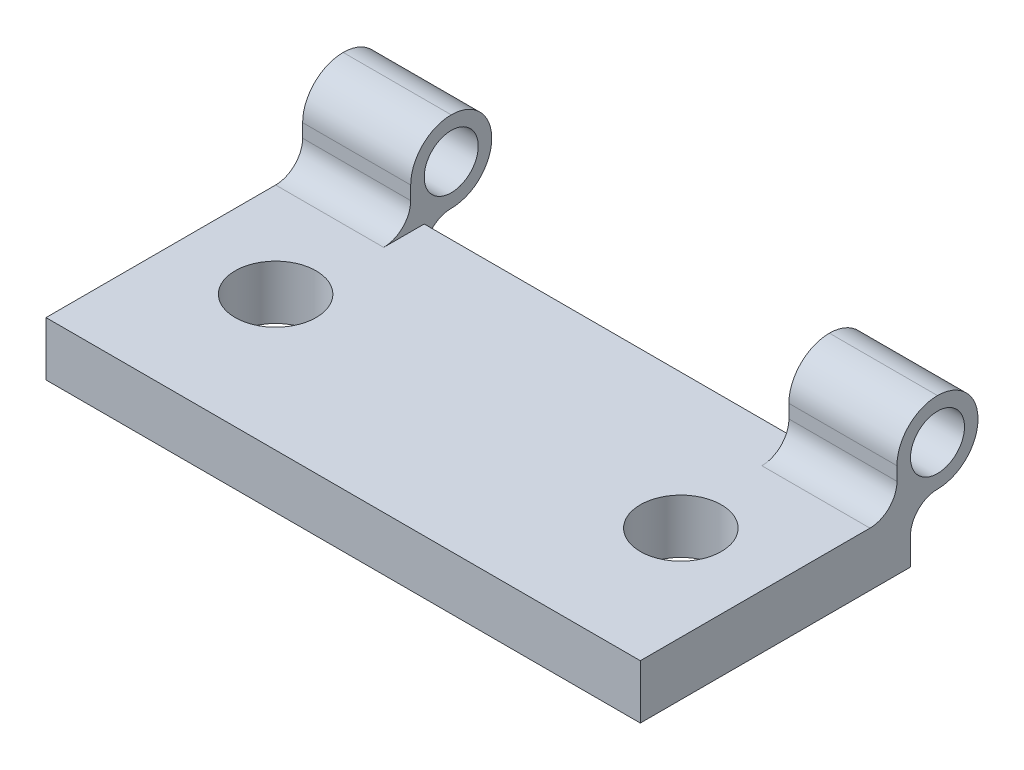
ISO-10303-21;
HEADER;
FILE_DESCRIPTION(('STEP AP214'),'2;1');
FILE_NAME('part.step','',(''),(''),'','','');
FILE_SCHEMA(('AUTOMOTIVE_DESIGN { 1 0 10303 214 1 1 1 1 }'));
ENDSEC;
DATA;
#1=APPLICATION_CONTEXT('core data for automotive mechanical design processes');
#2=APPLICATION_PROTOCOL_DEFINITION('international standard','automotive_design',2000,#1);
#3=PRODUCT_CONTEXT('',#1,'mechanical');
#4=PRODUCT('Part','Part','',(#3));
#5=PRODUCT_RELATED_PRODUCT_CATEGORY('part','',(#4));
#6=PRODUCT_DEFINITION_FORMATION('','',#4);
#7=PRODUCT_DEFINITION_CONTEXT('part definition',#1,'design');
#8=PRODUCT_DEFINITION('design','',#6,#7);
#9=PRODUCT_DEFINITION_SHAPE('','',#8);
#10=(LENGTH_UNIT() NAMED_UNIT(*) SI_UNIT(.MILLI.,.METRE.));
#11=(NAMED_UNIT(*) PLANE_ANGLE_UNIT() SI_UNIT($,.RADIAN.));
#12=(NAMED_UNIT(*) SI_UNIT($,.STERADIAN.) SOLID_ANGLE_UNIT());
#13=UNCERTAINTY_MEASURE_WITH_UNIT(LENGTH_MEASURE(1.E-05),#10,'distance_accuracy_value','');
#14=(GEOMETRIC_REPRESENTATION_CONTEXT(3) GLOBAL_UNCERTAINTY_ASSIGNED_CONTEXT((#13)) GLOBAL_UNIT_ASSIGNED_CONTEXT((#10,
#11,#12)) REPRESENTATION_CONTEXT('',''));
#15=CARTESIAN_POINT('',(0.,0.,0.));
#16=DIRECTION('',(0.,0.,1.));
#17=DIRECTION('',(1.,0.,0.));
#18=AXIS2_PLACEMENT_3D('',#15,#16,#17);
#19=CARTESIAN_POINT('',(0.,2.,0.));
#20=DIRECTION('',(0.,1.,0.));
#21=DIRECTION('',(0.,0.,1.));
#22=AXIS2_PLACEMENT_3D('',#19,#20,#21);
#23=PLANE('',#22);
#24=DIRECTION('',(0.,0.,-1.));
#25=VECTOR('',#24,1.);
#26=CARTESIAN_POINT('',(11.,2.,-5.));
#27=LINE('',#26,#25);
#28=CARTESIAN_POINT('',(11.,2.,5.));
#29=VERTEX_POINT('',#28);
#30=CARTESIAN_POINT('',(11.,2.,-3.5));
#31=VERTEX_POINT('',#30);
#32=EDGE_CURVE('E212',#29,#31,#27,.T.);
#33=ORIENTED_EDGE('',*,*,#32,.T.);
#34=DIRECTION('',(1.,0.,0.));
#35=VECTOR('',#34,1.);
#36=CARTESIAN_POINT('',(0.,2.,-3.5));
#37=LINE('',#36,#35);
#38=CARTESIAN_POINT('',(6.99999999999999,2.,-3.5));
#39=VERTEX_POINT('',#38);
#40=EDGE_CURVE('E277',#31,#39,#37,.F.);
#41=ORIENTED_EDGE('',*,*,#40,.T.);
#42=DIRECTION('',(0.,0.,1.));
#43=VECTOR('',#42,1.);
#44=CARTESIAN_POINT('',(7.,2.,0.));
#45=LINE('',#44,#43);
#46=CARTESIAN_POINT('',(6.99999999999999,2.,-5.));
#47=VERTEX_POINT('',#46);
#48=EDGE_CURVE('E219',#47,#39,#45,.T.);
#49=ORIENTED_EDGE('',*,*,#48,.F.);
#50=DIRECTION('',(-1.,0.,0.));
#51=VECTOR('',#50,1.);
#52=CARTESIAN_POINT('',(-11.,2.,-5.));
#53=LINE('',#52,#51);
#54=CARTESIAN_POINT('',(-6.99999999999999,2.,-5.));
#55=VERTEX_POINT('',#54);
#56=EDGE_CURVE('E175',#47,#55,#53,.T.);
#57=ORIENTED_EDGE('',*,*,#56,.T.);
#58=DIRECTION('',(0.,0.,1.));
#59=VECTOR('',#58,1.);
#60=CARTESIAN_POINT('',(-7.,2.,0.));
#61=LINE('',#60,#59);
#62=CARTESIAN_POINT('',(-6.99999999999999,2.,-3.5));
#63=VERTEX_POINT('',#62);
#64=EDGE_CURVE('E419',#55,#63,#61,.T.);
#65=ORIENTED_EDGE('',*,*,#64,.T.);
#66=DIRECTION('',(-1.,0.,0.));
#67=VECTOR('',#66,1.);
#68=CARTESIAN_POINT('',(-11.,2.,-3.5));
#69=LINE('',#68,#67);
#70=CARTESIAN_POINT('',(-11.,2.,-3.5));
#71=VERTEX_POINT('',#70);
#72=EDGE_CURVE('E172',#63,#71,#69,.T.);
#73=ORIENTED_EDGE('',*,*,#72,.T.);
#74=DIRECTION('',(0.,0.,1.));
#75=VECTOR('',#74,1.);
#76=CARTESIAN_POINT('',(-11.,2.,-5.));
#77=LINE('',#76,#75);
#78=CARTESIAN_POINT('',(-11.,2.,5.));
#79=VERTEX_POINT('',#78);
#80=EDGE_CURVE('E164',#71,#79,#77,.T.);
#81=ORIENTED_EDGE('',*,*,#80,.T.);
#82=DIRECTION('',(1.,0.,0.));
#83=VECTOR('',#82,1.);
#84=CARTESIAN_POINT('',(-11.,2.,5.));
#85=LINE('',#84,#83);
#86=EDGE_CURVE('E169',#79,#29,#85,.T.);
#87=ORIENTED_EDGE('',*,*,#86,.T.);
#88=EDGE_LOOP('',(#33,#41,#49,#57,#65,#73,#81,#87));
#89=FACE_BOUND('',#88,.T.);
#90=CARTESIAN_POINT('',(-7.5,2.,0.));
#91=DIRECTION('',(0.,1.,0.));
#92=DIRECTION('',(0.,0.,1.));
#93=AXIS2_PLACEMENT_3D('',#90,#91,#92);
#94=CIRCLE('',#93,1.5);
#95=CARTESIAN_POINT('',(-7.5,2.,1.5));
#96=VERTEX_POINT('',#95);
#97=EDGE_CURVE('E204',#96,#96,#94,.T.);
#98=ORIENTED_EDGE('',*,*,#97,.F.);
#99=EDGE_LOOP('',(#98));
#100=FACE_BOUND('',#99,.T.);
#101=CARTESIAN_POINT('',(7.5,2.,0.));
#102=DIRECTION('',(0.,1.,0.));
#103=DIRECTION('',(0.,0.,1.));
#104=AXIS2_PLACEMENT_3D('',#101,#102,#103);
#105=CIRCLE('',#104,1.5);
#106=CARTESIAN_POINT('',(7.5,2.,1.5));
#107=VERTEX_POINT('',#106);
#108=EDGE_CURVE('E379',#107,#107,#105,.T.);
#109=ORIENTED_EDGE('',*,*,#108,.F.);
#110=EDGE_LOOP('',(#109));
#111=FACE_BOUND('',#110,.T.);
#112=ADVANCED_FACE('F41',(#89,#100,#111),#23,.T.);
#113=CARTESIAN_POINT('',(0.,0.,0.));
#114=DIRECTION('',(0.,1.,0.));
#115=DIRECTION('',(0.,0.,1.));
#116=AXIS2_PLACEMENT_3D('',#113,#114,#115);
#117=PLANE('',#116);
#118=DIRECTION('',(0.,0.,-1.));
#119=VECTOR('',#118,1.);
#120=CARTESIAN_POINT('',(11.,0.,-5.));
#121=LINE('',#120,#119);
#122=CARTESIAN_POINT('',(11.,0.,5.));
#123=VERTEX_POINT('',#122);
#124=CARTESIAN_POINT('',(11.,0.,-5.));
#125=VERTEX_POINT('',#124);
#126=EDGE_CURVE('E199',#123,#125,#121,.T.);
#127=ORIENTED_EDGE('',*,*,#126,.F.);
#128=DIRECTION('',(1.,0.,0.));
#129=VECTOR('',#128,1.);
#130=CARTESIAN_POINT('',(-11.,0.,5.));
#131=LINE('',#130,#129);
#132=CARTESIAN_POINT('',(-11.,0.,5.));
#133=VERTEX_POINT('',#132);
#134=EDGE_CURVE('E210',#133,#123,#131,.T.);
#135=ORIENTED_EDGE('',*,*,#134,.F.);
#136=DIRECTION('',(0.,0.,1.));
#137=VECTOR('',#136,1.);
#138=CARTESIAN_POINT('',(-11.,0.,-5.));
#139=LINE('',#138,#137);
#140=CARTESIAN_POINT('',(-11.,0.,-5.));
#141=VERTEX_POINT('',#140);
#142=EDGE_CURVE('E183',#141,#133,#139,.T.);
#143=ORIENTED_EDGE('',*,*,#142,.F.);
#144=DIRECTION('',(-1.,0.,0.));
#145=VECTOR('',#144,1.);
#146=CARTESIAN_POINT('',(-11.,0.,-5.));
#147=LINE('',#146,#145);
#148=EDGE_CURVE('E203',#125,#141,#147,.T.);
#149=ORIENTED_EDGE('',*,*,#148,.F.);
#150=EDGE_LOOP('',(#127,#135,#143,#149));
#151=FACE_BOUND('',#150,.T.);
#152=CARTESIAN_POINT('',(-7.5,0.,0.));
#153=DIRECTION('',(0.,1.,0.));
#154=DIRECTION('',(0.,0.,1.));
#155=AXIS2_PLACEMENT_3D('',#152,#153,#154);
#156=CIRCLE('',#155,1.5);
#157=CARTESIAN_POINT('',(-7.5,0.,1.5));
#158=VERTEX_POINT('',#157);
#159=EDGE_CURVE('E383',#158,#158,#156,.T.);
#160=ORIENTED_EDGE('',*,*,#159,.T.);
#161=EDGE_LOOP('',(#160));
#162=FACE_BOUND('',#161,.T.);
#163=CARTESIAN_POINT('',(7.5,0.,0.));
#164=DIRECTION('',(0.,1.,0.));
#165=DIRECTION('',(0.,0.,1.));
#166=AXIS2_PLACEMENT_3D('',#163,#164,#165);
#167=CIRCLE('',#166,1.5);
#168=CARTESIAN_POINT('',(7.5,0.,1.5));
#169=VERTEX_POINT('',#168);
#170=EDGE_CURVE('E384',#169,#169,#167,.T.);
#171=ORIENTED_EDGE('',*,*,#170,.T.);
#172=EDGE_LOOP('',(#171));
#173=FACE_BOUND('',#172,.T.);
#174=ADVANCED_FACE('F464',(#151,#162,#173),#117,.F.);
#175=CARTESIAN_POINT('',(11.,2.,-5.));
#176=DIRECTION('',(-1.,0.,0.));
#177=DIRECTION('',(0.,0.,1.));
#178=AXIS2_PLACEMENT_3D('',#175,#176,#177);
#179=PLANE('',#178);
#180=CARTESIAN_POINT('',(11.,1.,-6.));
#181=DIRECTION('',(-1.,0.,0.));
#182=DIRECTION('',(0.,0.,1.));
#183=AXIS2_PLACEMENT_3D('',#180,#181,#182);
#184=CIRCLE('',#183,1.);
#185=CARTESIAN_POINT('',(11.,1.,-5.));
#186=VERTEX_POINT('',#185);
#187=CARTESIAN_POINT('',(11.,2.,-6.));
#188=VERTEX_POINT('',#187);
#189=EDGE_CURVE('E326',#186,#188,#184,.T.);
#190=ORIENTED_EDGE('',*,*,#189,.T.);
#191=CARTESIAN_POINT('',(11.,3.5,-6.));
#192=DIRECTION('',(-1.,0.,0.));
#193=DIRECTION('',(0.,0.,1.));
#194=AXIS2_PLACEMENT_3D('',#191,#192,#193);
#195=CIRCLE('',#194,1.5);
#196=CARTESIAN_POINT('',(11.,3.5,-7.5));
#197=VERTEX_POINT('',#196);
#198=EDGE_CURVE('E50',#188,#197,#195,.F.);
#199=ORIENTED_EDGE('',*,*,#198,.T.);
#200=CARTESIAN_POINT('',(11.,3.5,-6.));
#201=DIRECTION('',(-1.,0.,0.));
#202=DIRECTION('',(0.,0.,1.));
#203=AXIS2_PLACEMENT_3D('',#200,#201,#202);
#204=CIRCLE('',#203,1.5);
#205=CARTESIAN_POINT('',(11.,5.,-6.));
#206=VERTEX_POINT('',#205);
#207=EDGE_CURVE('E228',#197,#206,#204,.F.);
#208=ORIENTED_EDGE('',*,*,#207,.T.);
#209=CARTESIAN_POINT('',(11.,3.5,-6.));
#210=DIRECTION('',(-1.,0.,0.));
#211=DIRECTION('',(0.,0.,1.));
#212=AXIS2_PLACEMENT_3D('',#209,#210,#211);
#213=CIRCLE('',#212,1.5);
#214=CARTESIAN_POINT('',(11.,3.5,-4.5));
#215=VERTEX_POINT('',#214);
#216=EDGE_CURVE('E224',#206,#215,#213,.F.);
#217=ORIENTED_EDGE('',*,*,#216,.T.);
#218=DIRECTION('',(0.,1.,0.));
#219=VECTOR('',#218,1.);
#220=CARTESIAN_POINT('',(11.,0.,-4.5));
#221=LINE('',#220,#219);
#222=CARTESIAN_POINT('',(11.,3.,-4.5));
#223=VERTEX_POINT('',#222);
#224=EDGE_CURVE('E374',#223,#215,#221,.T.);
#225=ORIENTED_EDGE('',*,*,#224,.F.);
#226=CARTESIAN_POINT('',(11.,3.,-3.5));
#227=DIRECTION('',(-1.,0.,0.));
#228=DIRECTION('',(0.,0.,1.));
#229=AXIS2_PLACEMENT_3D('',#226,#227,#228);
#230=CIRCLE('',#229,1.);
#231=EDGE_CURVE('E284',#223,#31,#230,.T.);
#232=ORIENTED_EDGE('',*,*,#231,.T.);
#233=ORIENTED_EDGE('',*,*,#32,.F.);
#234=DIRECTION('',(0.,-1.,0.));
#235=VECTOR('',#234,1.);
#236=CARTESIAN_POINT('',(11.,2.,5.));
#237=LINE('',#236,#235);
#238=EDGE_CURVE('E188',#29,#123,#237,.T.);
#239=ORIENTED_EDGE('',*,*,#238,.T.);
#240=ORIENTED_EDGE('',*,*,#126,.T.);
#241=DIRECTION('',(0.,-1.,0.));
#242=VECTOR('',#241,1.);
#243=CARTESIAN_POINT('',(11.,2.,-5.));
#244=LINE('',#243,#242);
#245=EDGE_CURVE('E216',#186,#125,#244,.T.);
#246=ORIENTED_EDGE('',*,*,#245,.F.);
#247=EDGE_LOOP('',(#190,#199,#208,#217,#225,#232,#233,#239,#240,#246));
#248=FACE_BOUND('',#247,.T.);
#249=CARTESIAN_POINT('',(11.,3.5,-6.));
#250=DIRECTION('',(1.,0.,0.));
#251=DIRECTION('',(0.,0.,-1.));
#252=AXIS2_PLACEMENT_3D('',#249,#250,#251);
#253=CIRCLE('',#252,1.);
#254=CARTESIAN_POINT('',(11.,3.5,-7.));
#255=VERTEX_POINT('',#254);
#256=EDGE_CURVE('E370',#255,#255,#253,.T.);
#257=ORIENTED_EDGE('',*,*,#256,.F.);
#258=EDGE_LOOP('',(#257));
#259=FACE_BOUND('',#258,.T.);
#260=ADVANCED_FACE('F338',(#248,#259),#179,.F.);
#261=CARTESIAN_POINT('',(-11.,2.,-5.));
#262=DIRECTION('',(0.,0.,1.));
#263=DIRECTION('',(1.,0.,0.));
#264=AXIS2_PLACEMENT_3D('',#261,#262,#263);
#265=PLANE('',#264);
#266=DIRECTION('',(0.,-1.,0.));
#267=VECTOR('',#266,1.);
#268=CARTESIAN_POINT('',(-11.,2.,-5.));
#269=LINE('',#268,#267);
#270=CARTESIAN_POINT('',(-11.,1.,-5.));
#271=VERTEX_POINT('',#270);
#272=EDGE_CURVE('E187',#271,#141,#269,.T.);
#273=ORIENTED_EDGE('',*,*,#272,.F.);
#274=DIRECTION('',(1.,0.,0.));
#275=VECTOR('',#274,1.);
#276=CARTESIAN_POINT('',(-11.,1.,-5.));
#277=LINE('',#276,#275);
#278=CARTESIAN_POINT('',(-6.99999999999999,1.,-5.));
#279=VERTEX_POINT('',#278);
#280=EDGE_CURVE('E305',#271,#279,#277,.T.);
#281=ORIENTED_EDGE('',*,*,#280,.T.);
#282=DIRECTION('',(0.,1.,0.));
#283=VECTOR('',#282,1.);
#284=CARTESIAN_POINT('',(-6.99999999999999,0.,-5.));
#285=LINE('',#284,#283);
#286=EDGE_CURVE('E302',#279,#55,#285,.T.);
#287=ORIENTED_EDGE('',*,*,#286,.T.);
#288=ORIENTED_EDGE('',*,*,#56,.F.);
#289=DIRECTION('',(0.,-1.,0.));
#290=VECTOR('',#289,1.);
#291=CARTESIAN_POINT('',(6.99999999999999,0.,-5.));
#292=LINE('',#291,#290);
#293=CARTESIAN_POINT('',(6.99999999999999,1.,-5.));
#294=VERTEX_POINT('',#293);
#295=EDGE_CURVE('E57',#47,#294,#292,.T.);
#296=ORIENTED_EDGE('',*,*,#295,.T.);
#297=DIRECTION('',(-1.,0.,0.));
#298=VECTOR('',#297,1.);
#299=CARTESIAN_POINT('',(11.,1.,-5.));
#300=LINE('',#299,#298);
#301=EDGE_CURVE('E297',#294,#186,#300,.F.);
#302=ORIENTED_EDGE('',*,*,#301,.T.);
#303=ORIENTED_EDGE('',*,*,#245,.T.);
#304=ORIENTED_EDGE('',*,*,#148,.T.);
#305=EDGE_LOOP('',(#273,#281,#287,#288,#296,#302,#303,#304));
#306=FACE_BOUND('',#305,.T.);
#307=ADVANCED_FACE('F356',(#306),#265,.F.);
#308=CARTESIAN_POINT('',(-11.,2.,-5.));
#309=DIRECTION('',(1.,0.,0.));
#310=DIRECTION('',(0.,0.,-1.));
#311=AXIS2_PLACEMENT_3D('',#308,#309,#310);
#312=PLANE('',#311);
#313=CARTESIAN_POINT('',(-11.,3.5,-6.));
#314=DIRECTION('',(1.,0.,0.));
#315=DIRECTION('',(0.,0.,-1.));
#316=AXIS2_PLACEMENT_3D('',#313,#314,#315);
#317=CIRCLE('',#316,1.5);
#318=CARTESIAN_POINT('',(-11.,5.,-6.));
#319=VERTEX_POINT('',#318);
#320=CARTESIAN_POINT('',(-11.,3.5,-7.5));
#321=VERTEX_POINT('',#320);
#322=EDGE_CURVE('E244',#319,#321,#317,.F.);
#323=ORIENTED_EDGE('',*,*,#322,.T.);
#324=CARTESIAN_POINT('',(-11.,3.5,-6.));
#325=DIRECTION('',(1.,0.,0.));
#326=DIRECTION('',(0.,0.,-1.));
#327=AXIS2_PLACEMENT_3D('',#324,#325,#326);
#328=CIRCLE('',#327,1.5);
#329=CARTESIAN_POINT('',(-11.,2.,-6.));
#330=VERTEX_POINT('',#329);
#331=EDGE_CURVE('E330',#321,#330,#328,.F.);
#332=ORIENTED_EDGE('',*,*,#331,.T.);
#333=CARTESIAN_POINT('',(-11.,1.,-6.));
#334=DIRECTION('',(1.,0.,0.));
#335=DIRECTION('',(0.,0.,-1.));
#336=AXIS2_PLACEMENT_3D('',#333,#334,#335);
#337=CIRCLE('',#336,1.);
#338=EDGE_CURVE('E320',#330,#271,#337,.T.);
#339=ORIENTED_EDGE('',*,*,#338,.T.);
#340=ORIENTED_EDGE('',*,*,#272,.T.);
#341=ORIENTED_EDGE('',*,*,#142,.T.);
#342=DIRECTION('',(0.,-1.,0.));
#343=VECTOR('',#342,1.);
#344=CARTESIAN_POINT('',(-11.,2.,5.));
#345=LINE('',#344,#343);
#346=EDGE_CURVE('E178',#79,#133,#345,.T.);
#347=ORIENTED_EDGE('',*,*,#346,.F.);
#348=ORIENTED_EDGE('',*,*,#80,.F.);
#349=CARTESIAN_POINT('',(-11.,3.,-3.5));
#350=DIRECTION('',(1.,0.,0.));
#351=DIRECTION('',(0.,0.,-1.));
#352=AXIS2_PLACEMENT_3D('',#349,#350,#351);
#353=CIRCLE('',#352,1.);
#354=CARTESIAN_POINT('',(-11.,3.,-4.5));
#355=VERTEX_POINT('',#354);
#356=EDGE_CURVE('E290',#71,#355,#353,.T.);
#357=ORIENTED_EDGE('',*,*,#356,.T.);
#358=DIRECTION('',(0.,1.,0.));
#359=VECTOR('',#358,1.);
#360=CARTESIAN_POINT('',(-11.,0.,-4.5));
#361=LINE('',#360,#359);
#362=CARTESIAN_POINT('',(-11.,3.5,-4.5));
#363=VERTEX_POINT('',#362);
#364=EDGE_CURVE('E410',#355,#363,#361,.T.);
#365=ORIENTED_EDGE('',*,*,#364,.T.);
#366=CARTESIAN_POINT('',(-11.,3.5,-6.));
#367=DIRECTION('',(1.,0.,0.));
#368=DIRECTION('',(0.,0.,-1.));
#369=AXIS2_PLACEMENT_3D('',#366,#367,#368);
#370=CIRCLE('',#369,1.5);
#371=EDGE_CURVE('E241',#363,#319,#370,.F.);
#372=ORIENTED_EDGE('',*,*,#371,.T.);
#373=EDGE_LOOP('',(#323,#332,#339,#340,#341,#347,#348,#357,#365,#372));
#374=FACE_BOUND('',#373,.T.);
#375=CARTESIAN_POINT('',(-11.,3.5,-6.));
#376=DIRECTION('',(1.,0.,0.));
#377=DIRECTION('',(0.,0.,-1.));
#378=AXIS2_PLACEMENT_3D('',#375,#376,#377);
#379=CIRCLE('',#378,1.);
#380=CARTESIAN_POINT('',(-11.,3.5,-7.));
#381=VERTEX_POINT('',#380);
#382=EDGE_CURVE('E267',#381,#381,#379,.T.);
#383=ORIENTED_EDGE('',*,*,#382,.T.);
#384=EDGE_LOOP('',(#383));
#385=FACE_BOUND('',#384,.T.);
#386=ADVANCED_FACE('F180',(#374,#385),#312,.F.);
#387=CARTESIAN_POINT('',(-11.,2.,5.));
#388=DIRECTION('',(0.,0.,-1.));
#389=DIRECTION('',(-1.,0.,0.));
#390=AXIS2_PLACEMENT_3D('',#387,#388,#389);
#391=PLANE('',#390);
#392=ORIENTED_EDGE('',*,*,#134,.T.);
#393=ORIENTED_EDGE('',*,*,#238,.F.);
#394=ORIENTED_EDGE('',*,*,#86,.F.);
#395=ORIENTED_EDGE('',*,*,#346,.T.);
#396=EDGE_LOOP('',(#392,#393,#394,#395));
#397=FACE_BOUND('',#396,.T.);
#398=ADVANCED_FACE('F190',(#397),#391,.F.);
#399=CARTESIAN_POINT('',(-7.5,2.,0.));
#400=DIRECTION('',(0.,-1.,0.));
#401=DIRECTION('',(0.,0.,-1.));
#402=AXIS2_PLACEMENT_3D('',#399,#400,#401);
#403=CYLINDRICAL_SURFACE('',#402,1.5);
#404=ORIENTED_EDGE('',*,*,#97,.T.);
#405=EDGE_LOOP('',(#404));
#406=FACE_BOUND('',#405,.T.);
#407=ORIENTED_EDGE('',*,*,#159,.F.);
#408=EDGE_LOOP('',(#407));
#409=FACE_BOUND('',#408,.T.);
#410=ADVANCED_FACE('F474',(#406,#409),#403,.F.);
#411=CARTESIAN_POINT('',(7.5,2.,0.));
#412=DIRECTION('',(0.,-1.,0.));
#413=DIRECTION('',(0.,0.,-1.));
#414=AXIS2_PLACEMENT_3D('',#411,#412,#413);
#415=CYLINDRICAL_SURFACE('',#414,1.5);
#416=ORIENTED_EDGE('',*,*,#108,.T.);
#417=EDGE_LOOP('',(#416));
#418=FACE_BOUND('',#417,.T.);
#419=ORIENTED_EDGE('',*,*,#170,.F.);
#420=EDGE_LOOP('',(#419));
#421=FACE_BOUND('',#420,.T.);
#422=ADVANCED_FACE('F472',(#418,#421),#415,.F.);
#423=CARTESIAN_POINT('',(6.99999999999999,0.,-4.5));
#424=DIRECTION('',(0.,0.,-1.));
#425=DIRECTION('',(-1.,0.,0.));
#426=AXIS2_PLACEMENT_3D('',#423,#424,#425);
#427=PLANE('',#426);
#428=DIRECTION('',(0.,1.,0.));
#429=VECTOR('',#428,1.);
#430=CARTESIAN_POINT('',(6.99999999999999,0.,-4.5));
#431=LINE('',#430,#429);
#432=CARTESIAN_POINT('',(6.99999999999999,3.,-4.5));
#433=VERTEX_POINT('',#432);
#434=CARTESIAN_POINT('',(6.99999999999999,3.5,-4.5));
#435=VERTEX_POINT('',#434);
#436=EDGE_CURVE('E368',#433,#435,#431,.T.);
#437=ORIENTED_EDGE('',*,*,#436,.F.);
#438=DIRECTION('',(1.,0.,0.));
#439=VECTOR('',#438,1.);
#440=CARTESIAN_POINT('',(6.99999999999999,3.,-4.5));
#441=LINE('',#440,#439);
#442=EDGE_CURVE('E262',#433,#223,#441,.T.);
#443=ORIENTED_EDGE('',*,*,#442,.T.);
#444=ORIENTED_EDGE('',*,*,#224,.T.);
#445=DIRECTION('',(1.,0.,0.));
#446=VECTOR('',#445,1.);
#447=CARTESIAN_POINT('',(6.99999999999999,3.5,-4.5));
#448=LINE('',#447,#446);
#449=EDGE_CURVE('E237',#215,#435,#448,.F.);
#450=ORIENTED_EDGE('',*,*,#449,.T.);
#451=EDGE_LOOP('',(#437,#443,#444,#450));
#452=FACE_BOUND('',#451,.T.);
#453=ADVANCED_FACE('F400',(#452),#427,.F.);
#454=CARTESIAN_POINT('',(6.99999999999999,3.5,-6.));
#455=DIRECTION('',(1.,0.,0.));
#456=DIRECTION('',(0.,0.,-1.));
#457=AXIS2_PLACEMENT_3D('',#454,#455,#456);
#458=CYLINDRICAL_SURFACE('',#457,1.);
#459=CARTESIAN_POINT('',(6.99999999999999,3.5,-6.));
#460=DIRECTION('',(1.,0.,0.));
#461=DIRECTION('',(0.,0.,-1.));
#462=AXIS2_PLACEMENT_3D('',#459,#460,#461);
#463=CIRCLE('',#462,1.);
#464=CARTESIAN_POINT('',(6.99999999999999,3.5,-7.));
#465=VERTEX_POINT('',#464);
#466=EDGE_CURVE('E378',#465,#465,#463,.T.);
#467=ORIENTED_EDGE('',*,*,#466,.F.);
#468=EDGE_LOOP('',(#467));
#469=FACE_BOUND('',#468,.T.);
#470=ORIENTED_EDGE('',*,*,#256,.T.);
#471=EDGE_LOOP('',(#470));
#472=FACE_BOUND('',#471,.T.);
#473=ADVANCED_FACE('F482',(#469,#472),#458,.F.);
#474=CARTESIAN_POINT('',(7.,0.,0.));
#475=DIRECTION('',(1.,0.,0.));
#476=DIRECTION('',(0.,0.,-1.));
#477=AXIS2_PLACEMENT_3D('',#474,#475,#476);
#478=PLANE('',#477);
#479=ORIENTED_EDGE('',*,*,#466,.T.);
#480=EDGE_LOOP('',(#479));
#481=FACE_BOUND('',#480,.T.);
#482=CARTESIAN_POINT('',(6.99999999999999,3.5,-6.));
#483=DIRECTION('',(1.,0.,0.));
#484=DIRECTION('',(0.,0.,-1.));
#485=AXIS2_PLACEMENT_3D('',#482,#483,#484);
#486=CIRCLE('',#485,1.5);
#487=CARTESIAN_POINT('',(6.99999999999999,5.,-6.));
#488=VERTEX_POINT('',#487);
#489=CARTESIAN_POINT('',(6.99999999999999,3.5,-7.5));
#490=VERTEX_POINT('',#489);
#491=EDGE_CURVE('E234',#488,#490,#486,.F.);
#492=ORIENTED_EDGE('',*,*,#491,.T.);
#493=CARTESIAN_POINT('',(6.99999999999999,3.5,-6.));
#494=DIRECTION('',(1.,0.,0.));
#495=DIRECTION('',(0.,0.,-1.));
#496=AXIS2_PLACEMENT_3D('',#493,#494,#495);
#497=CIRCLE('',#496,1.5);
#498=CARTESIAN_POINT('',(6.99999999999999,2.,-6.));
#499=VERTEX_POINT('',#498);
#500=EDGE_CURVE('E11',#490,#499,#497,.F.);
#501=ORIENTED_EDGE('',*,*,#500,.T.);
#502=CARTESIAN_POINT('',(6.99999999999999,1.,-6.));
#503=DIRECTION('',(1.,0.,0.));
#504=DIRECTION('',(0.,0.,-1.));
#505=AXIS2_PLACEMENT_3D('',#502,#503,#504);
#506=CIRCLE('',#505,1.);
#507=EDGE_CURVE('E323',#499,#294,#506,.T.);
#508=ORIENTED_EDGE('',*,*,#507,.T.);
#509=ORIENTED_EDGE('',*,*,#295,.F.);
#510=ORIENTED_EDGE('',*,*,#48,.T.);
#511=CARTESIAN_POINT('',(6.99999999999999,3.,-3.5));
#512=DIRECTION('',(1.,0.,0.));
#513=DIRECTION('',(0.,0.,-1.));
#514=AXIS2_PLACEMENT_3D('',#511,#512,#513);
#515=CIRCLE('',#514,1.);
#516=EDGE_CURVE('E287',#39,#433,#515,.T.);
#517=ORIENTED_EDGE('',*,*,#516,.T.);
#518=ORIENTED_EDGE('',*,*,#436,.T.);
#519=CARTESIAN_POINT('',(6.99999999999999,3.5,-6.));
#520=DIRECTION('',(1.,0.,0.));
#521=DIRECTION('',(0.,0.,-1.));
#522=AXIS2_PLACEMENT_3D('',#519,#520,#521);
#523=CIRCLE('',#522,1.5);
#524=EDGE_CURVE('E231',#435,#488,#523,.F.);
#525=ORIENTED_EDGE('',*,*,#524,.T.);
#526=EDGE_LOOP('',(#492,#501,#508,#509,#510,#517,#518,#525));
#527=FACE_BOUND('',#526,.T.);
#528=ADVANCED_FACE('F353',(#481,#527),#478,.F.);
#529=CARTESIAN_POINT('',(-6.99999999999999,0.,-4.5));
#530=DIRECTION('',(0.,0.,1.));
#531=DIRECTION('',(1.,0.,0.));
#532=AXIS2_PLACEMENT_3D('',#529,#530,#531);
#533=PLANE('',#532);
#534=ORIENTED_EDGE('',*,*,#364,.F.);
#535=DIRECTION('',(-1.,0.,0.));
#536=VECTOR('',#535,1.);
#537=CARTESIAN_POINT('',(-6.99999999999999,3.,-4.5));
#538=LINE('',#537,#536);
#539=CARTESIAN_POINT('',(-6.99999999999999,3.,-4.5));
#540=VERTEX_POINT('',#539);
#541=EDGE_CURVE('E281',#355,#540,#538,.F.);
#542=ORIENTED_EDGE('',*,*,#541,.T.);
#543=DIRECTION('',(0.,1.,0.));
#544=VECTOR('',#543,1.);
#545=CARTESIAN_POINT('',(-6.99999999999999,0.,-4.5));
#546=LINE('',#545,#544);
#547=CARTESIAN_POINT('',(-6.99999999999999,3.5,-4.5));
#548=VERTEX_POINT('',#547);
#549=EDGE_CURVE('E375',#540,#548,#546,.T.);
#550=ORIENTED_EDGE('',*,*,#549,.T.);
#551=DIRECTION('',(-1.,0.,0.));
#552=VECTOR('',#551,1.);
#553=CARTESIAN_POINT('',(-6.99999999999999,3.5,-4.5));
#554=LINE('',#553,#552);
#555=EDGE_CURVE('E258',#548,#363,#554,.T.);
#556=ORIENTED_EDGE('',*,*,#555,.T.);
#557=EDGE_LOOP('',(#534,#542,#550,#556));
#558=FACE_BOUND('',#557,.T.);
#559=ADVANCED_FACE('F456',(#558),#533,.T.);
#560=CARTESIAN_POINT('',(-6.99999999999999,3.5,-6.));
#561=DIRECTION('',(-1.,0.,0.));
#562=DIRECTION('',(0.,0.,1.));
#563=AXIS2_PLACEMENT_3D('',#560,#561,#562);
#564=CYLINDRICAL_SURFACE('',#563,1.);
#565=CARTESIAN_POINT('',(-6.99999999999999,3.5,-6.));
#566=DIRECTION('',(1.,0.,0.));
#567=DIRECTION('',(0.,0.,-1.));
#568=AXIS2_PLACEMENT_3D('',#565,#566,#567);
#569=CIRCLE('',#568,1.);
#570=CARTESIAN_POINT('',(-6.99999999999999,3.5,-7.));
#571=VERTEX_POINT('',#570);
#572=EDGE_CURVE('E413',#571,#571,#569,.T.);
#573=ORIENTED_EDGE('',*,*,#572,.T.);
#574=EDGE_LOOP('',(#573));
#575=FACE_BOUND('',#574,.T.);
#576=ORIENTED_EDGE('',*,*,#382,.F.);
#577=EDGE_LOOP('',(#576));
#578=FACE_BOUND('',#577,.T.);
#579=ADVANCED_FACE('F426',(#575,#578),#564,.F.);
#580=CARTESIAN_POINT('',(-7.,0.,0.));
#581=DIRECTION('',(-1.,0.,0.));
#582=DIRECTION('',(0.,0.,-1.));
#583=AXIS2_PLACEMENT_3D('',#580,#581,#582);
#584=PLANE('',#583);
#585=ORIENTED_EDGE('',*,*,#572,.F.);
#586=EDGE_LOOP('',(#585));
#587=FACE_BOUND('',#586,.T.);
#588=CARTESIAN_POINT('',(-6.99999999999999,1.,-6.));
#589=DIRECTION('',(-1.,0.,0.));
#590=DIRECTION('',(0.,0.,1.));
#591=AXIS2_PLACEMENT_3D('',#588,#589,#590);
#592=CIRCLE('',#591,1.);
#593=CARTESIAN_POINT('',(-6.99999999999999,2.,-6.));
#594=VERTEX_POINT('',#593);
#595=EDGE_CURVE('E317',#279,#594,#592,.T.);
#596=ORIENTED_EDGE('',*,*,#595,.T.);
#597=CARTESIAN_POINT('',(-6.99999999999999,3.5,-6.));
#598=DIRECTION('',(-1.,0.,0.));
#599=DIRECTION('',(0.,0.,1.));
#600=AXIS2_PLACEMENT_3D('',#597,#598,#599);
#601=CIRCLE('',#600,1.5);
#602=CARTESIAN_POINT('',(-6.99999999999999,3.5,-7.5));
#603=VERTEX_POINT('',#602);
#604=EDGE_CURVE('E333',#594,#603,#601,.F.);
#605=ORIENTED_EDGE('',*,*,#604,.T.);
#606=CARTESIAN_POINT('',(-6.99999999999999,3.5,-6.));
#607=DIRECTION('',(-1.,0.,0.));
#608=DIRECTION('',(0.,0.,1.));
#609=AXIS2_PLACEMENT_3D('',#606,#607,#608);
#610=CIRCLE('',#609,1.5);
#611=CARTESIAN_POINT('',(-6.99999999999999,5.,-6.));
#612=VERTEX_POINT('',#611);
#613=EDGE_CURVE('E255',#603,#612,#610,.F.);
#614=ORIENTED_EDGE('',*,*,#613,.T.);
#615=CARTESIAN_POINT('',(-6.99999999999999,3.5,-6.));
#616=DIRECTION('',(-1.,0.,0.));
#617=DIRECTION('',(0.,0.,1.));
#618=AXIS2_PLACEMENT_3D('',#615,#616,#617);
#619=CIRCLE('',#618,1.5);
#620=EDGE_CURVE('E251',#612,#548,#619,.F.);
#621=ORIENTED_EDGE('',*,*,#620,.T.);
#622=ORIENTED_EDGE('',*,*,#549,.F.);
#623=CARTESIAN_POINT('',(-6.99999999999999,3.,-3.5));
#624=DIRECTION('',(-1.,0.,0.));
#625=DIRECTION('',(0.,0.,1.));
#626=AXIS2_PLACEMENT_3D('',#623,#624,#625);
#627=CIRCLE('',#626,1.);
#628=EDGE_CURVE('E293',#540,#63,#627,.T.);
#629=ORIENTED_EDGE('',*,*,#628,.T.);
#630=ORIENTED_EDGE('',*,*,#64,.F.);
#631=ORIENTED_EDGE('',*,*,#286,.F.);
#632=EDGE_LOOP('',(#596,#605,#614,#621,#622,#629,#630,#631));
#633=FACE_BOUND('',#632,.T.);
#634=ADVANCED_FACE('F429',(#587,#633),#584,.F.);
#635=CARTESIAN_POINT('',(6.99999999999999,3.5,-6.));
#636=DIRECTION('',(1.,0.,0.));
#637=DIRECTION('',(0.,0.,-1.));
#638=AXIS2_PLACEMENT_3D('',#635,#636,#637);
#639=CYLINDRICAL_SURFACE('',#638,1.5);
#640=DIRECTION('',(1.,0.,0.));
#641=VECTOR('',#640,1.);
#642=CARTESIAN_POINT('',(6.99999999999999,5.,-6.));
#643=LINE('',#642,#641);
#644=EDGE_CURVE('E263',#488,#206,#643,.T.);
#645=ORIENTED_EDGE('',*,*,#644,.F.);
#646=ORIENTED_EDGE('',*,*,#524,.F.);
#647=ORIENTED_EDGE('',*,*,#449,.F.);
#648=ORIENTED_EDGE('',*,*,#216,.F.);
#649=EDGE_LOOP('',(#645,#646,#647,#648));
#650=FACE_BOUND('',#649,.T.);
#651=ADVANCED_FACE('F432',(#650),#639,.T.);
#652=CARTESIAN_POINT('',(6.99999999999999,3.5,-6.));
#653=DIRECTION('',(1.,0.,0.));
#654=DIRECTION('',(0.,0.,-1.));
#655=AXIS2_PLACEMENT_3D('',#652,#653,#654);
#656=CYLINDRICAL_SURFACE('',#655,1.5);
#657=ORIENTED_EDGE('',*,*,#491,.F.);
#658=ORIENTED_EDGE('',*,*,#644,.T.);
#659=ORIENTED_EDGE('',*,*,#207,.F.);
#660=DIRECTION('',(1.,0.,0.));
#661=VECTOR('',#660,1.);
#662=CARTESIAN_POINT('',(6.99999999999999,3.5,-7.5));
#663=LINE('',#662,#661);
#664=EDGE_CURVE('E220',#490,#197,#663,.T.);
#665=ORIENTED_EDGE('',*,*,#664,.F.);
#666=EDGE_LOOP('',(#657,#658,#659,#665));
#667=FACE_BOUND('',#666,.T.);
#668=ADVANCED_FACE('F348',(#667),#656,.T.);
#669=CARTESIAN_POINT('',(-6.99999999999999,3.5,-6.));
#670=DIRECTION('',(-1.,0.,0.));
#671=DIRECTION('',(0.,0.,1.));
#672=AXIS2_PLACEMENT_3D('',#669,#670,#671);
#673=CYLINDRICAL_SURFACE('',#672,1.5);
#674=ORIENTED_EDGE('',*,*,#555,.F.);
#675=ORIENTED_EDGE('',*,*,#620,.F.);
#676=DIRECTION('',(-1.,0.,0.));
#677=VECTOR('',#676,1.);
#678=CARTESIAN_POINT('',(-6.99999999999999,5.,-6.));
#679=LINE('',#678,#677);
#680=EDGE_CURVE('E268',#319,#612,#679,.F.);
#681=ORIENTED_EDGE('',*,*,#680,.F.);
#682=ORIENTED_EDGE('',*,*,#371,.F.);
#683=EDGE_LOOP('',(#674,#675,#681,#682));
#684=FACE_BOUND('',#683,.T.);
#685=ADVANCED_FACE('F452',(#684),#673,.T.);
#686=CARTESIAN_POINT('',(-6.99999999999999,3.5,-6.));
#687=DIRECTION('',(-1.,0.,0.));
#688=DIRECTION('',(0.,0.,1.));
#689=AXIS2_PLACEMENT_3D('',#686,#687,#688);
#690=CYLINDRICAL_SURFACE('',#689,1.5);
#691=ORIENTED_EDGE('',*,*,#613,.F.);
#692=DIRECTION('',(-1.,0.,0.));
#693=VECTOR('',#692,1.);
#694=CARTESIAN_POINT('',(-6.99999999999999,3.5,-7.5));
#695=LINE('',#694,#693);
#696=EDGE_CURVE('E247',#321,#603,#695,.F.);
#697=ORIENTED_EDGE('',*,*,#696,.F.);
#698=ORIENTED_EDGE('',*,*,#322,.F.);
#699=ORIENTED_EDGE('',*,*,#680,.T.);
#700=EDGE_LOOP('',(#691,#697,#698,#699));
#701=FACE_BOUND('',#700,.T.);
#702=ADVANCED_FACE('F446',(#701),#690,.T.);
#703=CARTESIAN_POINT('',(6.99999999999999,3.,-3.5));
#704=DIRECTION('',(1.,0.,0.));
#705=DIRECTION('',(0.,0.,-1.));
#706=AXIS2_PLACEMENT_3D('',#703,#704,#705);
#707=CYLINDRICAL_SURFACE('',#706,1.);
#708=ORIENTED_EDGE('',*,*,#516,.F.);
#709=ORIENTED_EDGE('',*,*,#40,.F.);
#710=ORIENTED_EDGE('',*,*,#231,.F.);
#711=ORIENTED_EDGE('',*,*,#442,.F.);
#712=EDGE_LOOP('',(#708,#709,#710,#711));
#713=FACE_BOUND('',#712,.T.);
#714=ADVANCED_FACE('F396',(#713),#707,.F.);
#715=CARTESIAN_POINT('',(0.,3.,-3.5));
#716=DIRECTION('',(1.,0.,0.));
#717=DIRECTION('',(0.,0.,-1.));
#718=AXIS2_PLACEMENT_3D('',#715,#716,#717);
#719=CYLINDRICAL_SURFACE('',#718,1.);
#720=ORIENTED_EDGE('',*,*,#628,.F.);
#721=ORIENTED_EDGE('',*,*,#541,.F.);
#722=ORIENTED_EDGE('',*,*,#356,.F.);
#723=ORIENTED_EDGE('',*,*,#72,.F.);
#724=EDGE_LOOP('',(#720,#721,#722,#723));
#725=FACE_BOUND('',#724,.T.);
#726=ADVANCED_FACE('F460',(#725),#719,.F.);
#727=CARTESIAN_POINT('',(-11.,1.,-6.));
#728=DIRECTION('',(1.,0.,0.));
#729=DIRECTION('',(0.,0.,-1.));
#730=AXIS2_PLACEMENT_3D('',#727,#728,#729);
#731=CYLINDRICAL_SURFACE('',#730,1.);
#732=ORIENTED_EDGE('',*,*,#338,.F.);
#733=DIRECTION('',(1.,0.,0.));
#734=VECTOR('',#733,1.);
#735=CARTESIAN_POINT('',(-7.,2.,-6.));
#736=LINE('',#735,#734);
#737=EDGE_CURVE('E309',#594,#330,#736,.F.);
#738=ORIENTED_EDGE('',*,*,#737,.F.);
#739=ORIENTED_EDGE('',*,*,#595,.F.);
#740=ORIENTED_EDGE('',*,*,#280,.F.);
#741=EDGE_LOOP('',(#732,#738,#739,#740));
#742=FACE_BOUND('',#741,.T.);
#743=ADVANCED_FACE('F440',(#742),#731,.F.);
#744=CARTESIAN_POINT('',(7.,1.,-6.));
#745=DIRECTION('',(1.,0.,0.));
#746=DIRECTION('',(0.,0.,-1.));
#747=AXIS2_PLACEMENT_3D('',#744,#745,#746);
#748=CYLINDRICAL_SURFACE('',#747,1.);
#749=ORIENTED_EDGE('',*,*,#189,.F.);
#750=ORIENTED_EDGE('',*,*,#301,.F.);
#751=ORIENTED_EDGE('',*,*,#507,.F.);
#752=DIRECTION('',(-1.,0.,0.));
#753=VECTOR('',#752,1.);
#754=CARTESIAN_POINT('',(6.99999999999999,2.,-6.));
#755=LINE('',#754,#753);
#756=EDGE_CURVE('E313',#188,#499,#755,.T.);
#757=ORIENTED_EDGE('',*,*,#756,.F.);
#758=EDGE_LOOP('',(#749,#750,#751,#757));
#759=FACE_BOUND('',#758,.T.);
#760=ADVANCED_FACE('F351',(#759),#748,.F.);
#761=CARTESIAN_POINT('',(-6.99999999999999,3.5,-6.));
#762=DIRECTION('',(-1.,0.,0.));
#763=DIRECTION('',(0.,0.,1.));
#764=AXIS2_PLACEMENT_3D('',#761,#762,#763);
#765=CYLINDRICAL_SURFACE('',#764,1.5);
#766=ORIENTED_EDGE('',*,*,#604,.F.);
#767=ORIENTED_EDGE('',*,*,#737,.T.);
#768=ORIENTED_EDGE('',*,*,#331,.F.);
#769=ORIENTED_EDGE('',*,*,#696,.T.);
#770=EDGE_LOOP('',(#766,#767,#768,#769));
#771=FACE_BOUND('',#770,.T.);
#772=ADVANCED_FACE('F442',(#771),#765,.T.);
#773=CARTESIAN_POINT('',(6.99999999999999,3.5,-6.));
#774=DIRECTION('',(1.,0.,0.));
#775=DIRECTION('',(0.,0.,-1.));
#776=AXIS2_PLACEMENT_3D('',#773,#774,#775);
#777=CYLINDRICAL_SURFACE('',#776,1.5);
#778=ORIENTED_EDGE('',*,*,#500,.F.);
#779=ORIENTED_EDGE('',*,*,#664,.T.);
#780=ORIENTED_EDGE('',*,*,#198,.F.);
#781=ORIENTED_EDGE('',*,*,#756,.T.);
#782=EDGE_LOOP('',(#778,#779,#780,#781));
#783=FACE_BOUND('',#782,.T.);
#784=ADVANCED_FACE('F43',(#783),#777,.T.);
#785=CLOSED_SHELL('',(#112,#174,#260,#307,#386,#398,#410,#422,#453,#473,#528,#559,#579,#634,
#651,#668,#685,#702,#714,#726,#743,#760,#772,#784));
#786=MANIFOLD_SOLID_BREP('B2',#785);
#787=ADVANCED_BREP_SHAPE_REPRESENTATION('',(#18,#786),#14);
#788=SHAPE_DEFINITION_REPRESENTATION(#9,#787);
ENDSEC;
END-ISO-10303-21;
